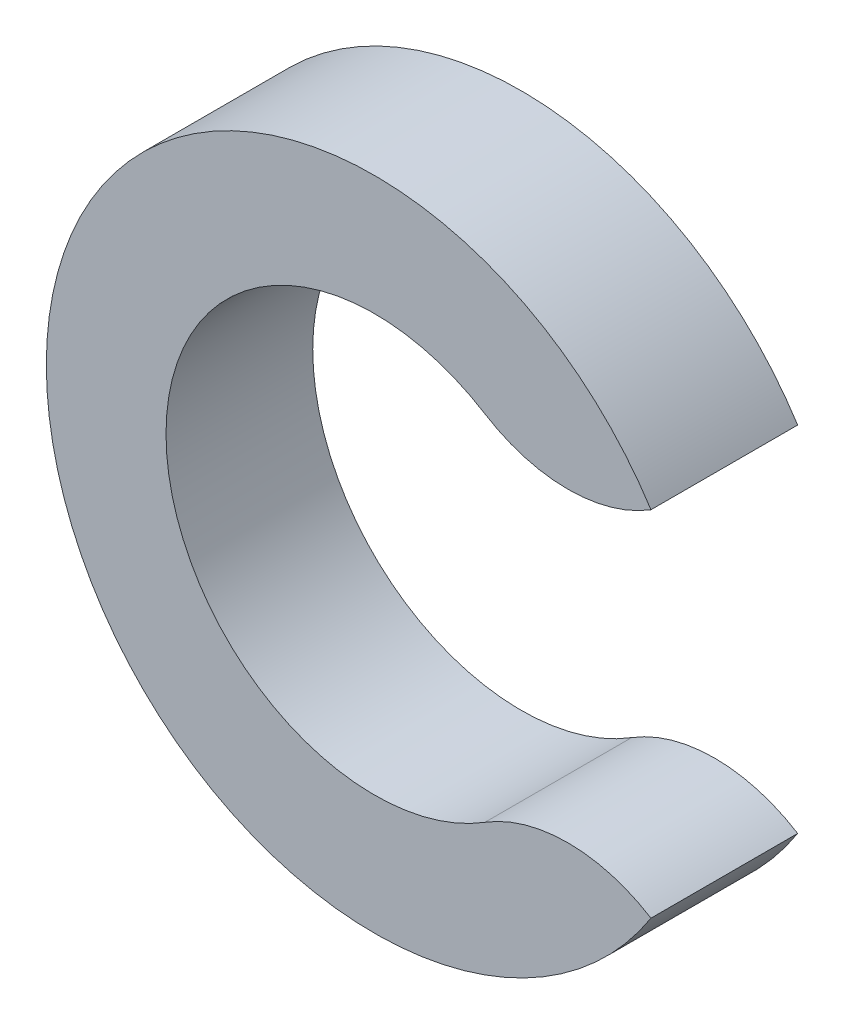
ISO-10303-21;
HEADER;
FILE_DESCRIPTION(('STEP AP214'),'2;1');
FILE_NAME('part.step','',(''),(''),'','','');
FILE_SCHEMA(('AUTOMOTIVE_DESIGN { 1 0 10303 214 1 1 1 1 }'));
ENDSEC;
DATA;
#1=APPLICATION_CONTEXT('core data for automotive mechanical design processes');
#2=APPLICATION_PROTOCOL_DEFINITION('international standard','automotive_design',2000,#1);
#3=PRODUCT_CONTEXT('',#1,'mechanical');
#4=PRODUCT('Part','Part','',(#3));
#5=PRODUCT_RELATED_PRODUCT_CATEGORY('part','',(#4));
#6=PRODUCT_DEFINITION_FORMATION('','',#4);
#7=PRODUCT_DEFINITION_CONTEXT('part definition',#1,'design');
#8=PRODUCT_DEFINITION('design','',#6,#7);
#9=PRODUCT_DEFINITION_SHAPE('','',#8);
#10=(LENGTH_UNIT() NAMED_UNIT(*) SI_UNIT(.MILLI.,.METRE.));
#11=(NAMED_UNIT(*) PLANE_ANGLE_UNIT() SI_UNIT($,.RADIAN.));
#12=(NAMED_UNIT(*) SI_UNIT($,.STERADIAN.) SOLID_ANGLE_UNIT());
#13=UNCERTAINTY_MEASURE_WITH_UNIT(LENGTH_MEASURE(1.E-05),#10,'distance_accuracy_value','');
#14=(GEOMETRIC_REPRESENTATION_CONTEXT(3) GLOBAL_UNCERTAINTY_ASSIGNED_CONTEXT((#13)) GLOBAL_UNIT_ASSIGNED_CONTEXT((#10,
#11,#12)) REPRESENTATION_CONTEXT('',''));
#15=CARTESIAN_POINT('',(0.,0.,0.));
#16=DIRECTION('',(0.,0.,1.));
#17=DIRECTION('',(1.,0.,0.));
#18=AXIS2_PLACEMENT_3D('',#15,#16,#17);
#19=CARTESIAN_POINT('',(2.50502602021504,-4.01217178620459,1.9));
#20=DIRECTION('',(0.,0.,-1.));
#21=DIRECTION('',(-1.,0.,0.));
#22=AXIS2_PLACEMENT_3D('',#19,#20,#21);
#23=CYLINDRICAL_SURFACE('',#22,2.02997651198931);
#24=CARTESIAN_POINT('',(2.50502602021504,-4.01217178620459,0.));
#25=DIRECTION('',(0.,0.,1.));
#26=DIRECTION('',(1.,0.,0.));
#27=AXIS2_PLACEMENT_3D('',#24,#25,#26);
#28=CIRCLE('',#27,2.02997651198931);
#29=CARTESIAN_POINT('',(1.42993738709624,-2.29025742417405,0.));
#30=VERTEX_POINT('',#29);
#31=CARTESIAN_POINT('',(3.58011465333383,-2.29025742417405,0.));
#32=VERTEX_POINT('',#31);
#33=EDGE_CURVE('E108',#30,#32,#28,.F.);
#34=ORIENTED_EDGE('',*,*,#33,.F.);
#35=DIRECTION('',(0.,0.,-1.));
#36=VECTOR('',#35,1.);
#37=CARTESIAN_POINT('',(1.42993738709624,-2.29025742417405,1.9));
#38=LINE('',#37,#36);
#39=CARTESIAN_POINT('',(1.42993738709624,-2.29025742417405,1.9));
#40=VERTEX_POINT('',#39);
#41=EDGE_CURVE('E11',#40,#30,#38,.T.);
#42=ORIENTED_EDGE('',*,*,#41,.F.);
#43=CARTESIAN_POINT('',(2.50502602021504,-4.01217178620459,1.9));
#44=DIRECTION('',(0.,0.,1.));
#45=DIRECTION('',(1.,0.,0.));
#46=AXIS2_PLACEMENT_3D('',#43,#44,#45);
#47=CIRCLE('',#46,2.02997651198931);
#48=CARTESIAN_POINT('',(3.58011465333383,-2.29025742417405,1.9));
#49=VERTEX_POINT('',#48);
#50=EDGE_CURVE('E92',#40,#49,#47,.F.);
#51=ORIENTED_EDGE('',*,*,#50,.T.);
#52=DIRECTION('',(0.,0.,-1.));
#53=VECTOR('',#52,1.);
#54=CARTESIAN_POINT('',(3.58011465333383,-2.29025742417405,1.9));
#55=LINE('',#54,#53);
#56=EDGE_CURVE('E81',#49,#32,#55,.T.);
#57=ORIENTED_EDGE('',*,*,#56,.T.);
#58=EDGE_LOOP('',(#34,#42,#51,#57));
#59=FACE_BOUND('',#58,.T.);
#60=ADVANCED_FACE('F41',(#59),#23,.T.);
#61=CARTESIAN_POINT('',(0.,0.,1.9));
#62=DIRECTION('',(0.,0.,-1.));
#63=DIRECTION('',(-1.,0.,0.));
#64=AXIS2_PLACEMENT_3D('',#61,#62,#63);
#65=CYLINDRICAL_SURFACE('',#64,2.7);
#66=CARTESIAN_POINT('',(0.,0.,0.));
#67=DIRECTION('',(0.,0.,1.));
#68=DIRECTION('',(1.,0.,0.));
#69=AXIS2_PLACEMENT_3D('',#66,#67,#68);
#70=CIRCLE('',#69,2.7);
#71=CARTESIAN_POINT('',(1.42993738709624,2.29025742417405,0.));
#72=VERTEX_POINT('',#71);
#73=EDGE_CURVE('E98',#30,#72,#70,.F.);
#74=ORIENTED_EDGE('',*,*,#73,.T.);
#75=DIRECTION('',(0.,0.,-1.));
#76=VECTOR('',#75,1.);
#77=CARTESIAN_POINT('',(1.42993738709624,2.29025742417405,1.9));
#78=LINE('',#77,#76);
#79=CARTESIAN_POINT('',(1.42993738709624,2.29025742417405,1.9));
#80=VERTEX_POINT('',#79);
#81=EDGE_CURVE('E50',#80,#72,#78,.T.);
#82=ORIENTED_EDGE('',*,*,#81,.F.);
#83=CARTESIAN_POINT('',(0.,0.,1.9));
#84=DIRECTION('',(0.,0.,1.));
#85=DIRECTION('',(1.,0.,0.));
#86=AXIS2_PLACEMENT_3D('',#83,#84,#85);
#87=CIRCLE('',#86,2.7);
#88=EDGE_CURVE('E87',#40,#80,#87,.F.);
#89=ORIENTED_EDGE('',*,*,#88,.F.);
#90=ORIENTED_EDGE('',*,*,#41,.T.);
#91=EDGE_LOOP('',(#74,#82,#89,#90));
#92=FACE_BOUND('',#91,.T.);
#93=ADVANCED_FACE('F96',(#92),#65,.F.);
#94=CARTESIAN_POINT('',(2.50502602021504,4.0121717862046,1.9));
#95=DIRECTION('',(0.,0.,-1.));
#96=DIRECTION('',(-1.,0.,0.));
#97=AXIS2_PLACEMENT_3D('',#94,#95,#96);
#98=CYLINDRICAL_SURFACE('',#97,2.02997651198931);
#99=CARTESIAN_POINT('',(2.50502602021504,4.0121717862046,0.));
#100=DIRECTION('',(0.,0.,1.));
#101=DIRECTION('',(1.,0.,0.));
#102=AXIS2_PLACEMENT_3D('',#99,#100,#101);
#103=CIRCLE('',#102,2.02997651198931);
#104=CARTESIAN_POINT('',(3.58011465333383,2.29025742417405,0.));
#105=VERTEX_POINT('',#104);
#106=EDGE_CURVE('E74',#72,#105,#103,.T.);
#107=ORIENTED_EDGE('',*,*,#106,.T.);
#108=DIRECTION('',(0.,0.,-1.));
#109=VECTOR('',#108,1.);
#110=CARTESIAN_POINT('',(3.58011465333383,2.29025742417405,1.9));
#111=LINE('',#110,#109);
#112=CARTESIAN_POINT('',(3.58011465333383,2.29025742417405,1.9));
#113=VERTEX_POINT('',#112);
#114=EDGE_CURVE('E100',#113,#105,#111,.T.);
#115=ORIENTED_EDGE('',*,*,#114,.F.);
#116=CARTESIAN_POINT('',(2.50502602021504,4.0121717862046,1.9));
#117=DIRECTION('',(0.,0.,1.));
#118=DIRECTION('',(1.,0.,0.));
#119=AXIS2_PLACEMENT_3D('',#116,#117,#118);
#120=CIRCLE('',#119,2.02997651198931);
#121=EDGE_CURVE('E91',#80,#113,#120,.T.);
#122=ORIENTED_EDGE('',*,*,#121,.F.);
#123=ORIENTED_EDGE('',*,*,#81,.T.);
#124=EDGE_LOOP('',(#107,#115,#122,#123));
#125=FACE_BOUND('',#124,.T.);
#126=ADVANCED_FACE('F101',(#125),#98,.T.);
#127=CARTESIAN_POINT('',(0.,0.,1.9));
#128=DIRECTION('',(0.,0.,-1.));
#129=DIRECTION('',(-1.,0.,0.));
#130=AXIS2_PLACEMENT_3D('',#127,#128,#129);
#131=CYLINDRICAL_SURFACE('',#130,4.25);
#132=CARTESIAN_POINT('',(0.,0.,0.));
#133=DIRECTION('',(0.,0.,1.));
#134=DIRECTION('',(1.,0.,0.));
#135=AXIS2_PLACEMENT_3D('',#132,#133,#134);
#136=CIRCLE('',#135,4.25);
#137=EDGE_CURVE('E116',#105,#32,#136,.T.);
#138=ORIENTED_EDGE('',*,*,#137,.T.);
#139=ORIENTED_EDGE('',*,*,#56,.F.);
#140=CARTESIAN_POINT('',(0.,0.,1.9));
#141=DIRECTION('',(0.,0.,1.));
#142=DIRECTION('',(1.,0.,0.));
#143=AXIS2_PLACEMENT_3D('',#140,#141,#142);
#144=CIRCLE('',#143,4.25);
#145=EDGE_CURVE('E58',#113,#49,#144,.T.);
#146=ORIENTED_EDGE('',*,*,#145,.F.);
#147=ORIENTED_EDGE('',*,*,#114,.T.);
#148=EDGE_LOOP('',(#138,#139,#146,#147));
#149=FACE_BOUND('',#148,.T.);
#150=ADVANCED_FACE('F124',(#149),#131,.T.);
#151=CARTESIAN_POINT('',(0.,0.,1.9));
#152=DIRECTION('',(0.,0.,1.));
#153=DIRECTION('',(1.,0.,0.));
#154=AXIS2_PLACEMENT_3D('',#151,#152,#153);
#155=PLANE('',#154);
#156=ORIENTED_EDGE('',*,*,#50,.F.);
#157=ORIENTED_EDGE('',*,*,#88,.T.);
#158=ORIENTED_EDGE('',*,*,#121,.T.);
#159=ORIENTED_EDGE('',*,*,#145,.T.);
#160=EDGE_LOOP('',(#156,#157,#158,#159));
#161=FACE_BOUND('',#160,.T.);
#162=ADVANCED_FACE('F89',(#161),#155,.T.);
#163=CARTESIAN_POINT('',(0.,0.,0.));
#164=DIRECTION('',(0.,0.,1.));
#165=DIRECTION('',(1.,0.,0.));
#166=AXIS2_PLACEMENT_3D('',#163,#164,#165);
#167=PLANE('',#166);
#168=ORIENTED_EDGE('',*,*,#33,.T.);
#169=ORIENTED_EDGE('',*,*,#137,.F.);
#170=ORIENTED_EDGE('',*,*,#106,.F.);
#171=ORIENTED_EDGE('',*,*,#73,.F.);
#172=EDGE_LOOP('',(#168,#169,#170,#171));
#173=FACE_BOUND('',#172,.T.);
#174=ADVANCED_FACE('F126',(#173),#167,.F.);
#175=CLOSED_SHELL('',(#60,#93,#126,#150,#162,#174));
#176=MANIFOLD_SOLID_BREP('B2',#175);
#177=ADVANCED_BREP_SHAPE_REPRESENTATION('',(#18,#176),#14);
#178=SHAPE_DEFINITION_REPRESENTATION(#9,#177);
ENDSEC;
END-ISO-10303-21;
